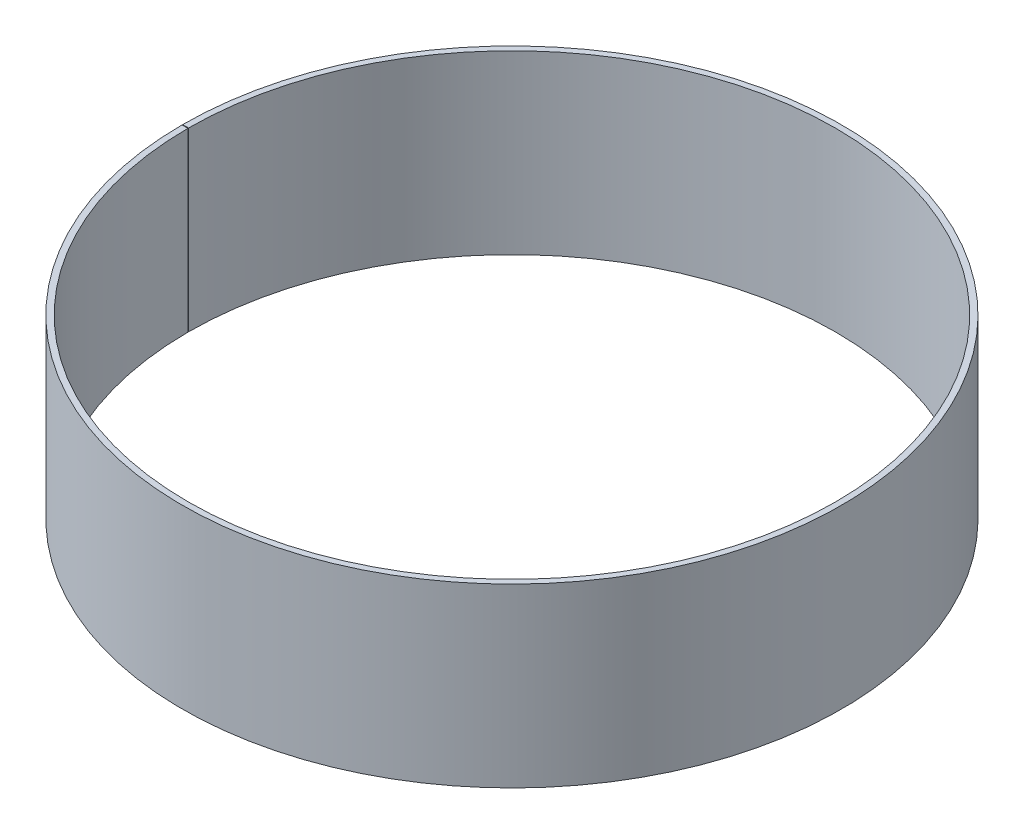
ISO-10303-21;
HEADER;
FILE_DESCRIPTION(('STEP AP214'),'2;1');
FILE_NAME('part.step','',(''),(''),'','','');
FILE_SCHEMA(('AUTOMOTIVE_DESIGN { 1 0 10303 214 1 1 1 1 }'));
ENDSEC;
DATA;
#1=APPLICATION_CONTEXT('core data for automotive mechanical design processes');
#2=APPLICATION_PROTOCOL_DEFINITION('international standard','automotive_design',2000,#1);
#3=PRODUCT_CONTEXT('',#1,'mechanical');
#4=PRODUCT('Part','Part','',(#3));
#5=PRODUCT_RELATED_PRODUCT_CATEGORY('part','',(#4));
#6=PRODUCT_DEFINITION_FORMATION('','',#4);
#7=PRODUCT_DEFINITION_CONTEXT('part definition',#1,'design');
#8=PRODUCT_DEFINITION('design','',#6,#7);
#9=PRODUCT_DEFINITION_SHAPE('','',#8);
#10=(LENGTH_UNIT() NAMED_UNIT(*) SI_UNIT(.MILLI.,.METRE.));
#11=(NAMED_UNIT(*) PLANE_ANGLE_UNIT() SI_UNIT($,.RADIAN.));
#12=(NAMED_UNIT(*) SI_UNIT($,.STERADIAN.) SOLID_ANGLE_UNIT());
#13=UNCERTAINTY_MEASURE_WITH_UNIT(LENGTH_MEASURE(1.E-05),#10,'distance_accuracy_value','');
#14=(GEOMETRIC_REPRESENTATION_CONTEXT(3) GLOBAL_UNCERTAINTY_ASSIGNED_CONTEXT((#13)) GLOBAL_UNIT_ASSIGNED_CONTEXT((#10,
#11,#12)) REPRESENTATION_CONTEXT('',''));
#15=CARTESIAN_POINT('',(0.,0.,0.));
#16=DIRECTION('',(0.,0.,1.));
#17=DIRECTION('',(1.,0.,0.));
#18=AXIS2_PLACEMENT_3D('',#15,#16,#17);
#19=CARTESIAN_POINT('',(0.,60.0000000000001,0.));
#20=DIRECTION('',(0.,-0.999999999999999,0.));
#21=DIRECTION('',(0.,0.,-0.999999999999999));
#22=AXIS2_PLACEMENT_3D('',#19,#20,#21);
#23=CYLINDRICAL_SURFACE('',#22,112.);
#24=CARTESIAN_POINT('',(0.,0.,0.));
#25=DIRECTION('',(0.,0.999999999999999,0.));
#26=DIRECTION('',(1.,0.,0.));
#27=AXIS2_PLACEMENT_3D('',#24,#25,#26);
#28=CIRCLE('',#27,112.);
#29=CARTESIAN_POINT('',(-111.999953718999,0.,0.101818181818092));
#30=VERTEX_POINT('',#29);
#31=CARTESIAN_POINT('',(-111.999953718999,0.,-0.101818181818314));
#32=VERTEX_POINT('',#31);
#33=EDGE_CURVE('E109',#30,#32,#28,.T.);
#34=ORIENTED_EDGE('',*,*,#33,.T.);
#35=DIRECTION('',(0.,-0.999999999999999,0.));
#36=VECTOR('',#35,1.);
#37=CARTESIAN_POINT('',(-111.999953718999,60.0000000000001,-0.101818181818314));
#38=LINE('',#37,#36);
#39=CARTESIAN_POINT('',(-111.999953718999,60.0000000000001,-0.101818181818314));
#40=VERTEX_POINT('',#39);
#41=EDGE_CURVE('E11',#40,#32,#38,.T.);
#42=ORIENTED_EDGE('',*,*,#41,.F.);
#43=CARTESIAN_POINT('',(0.,60.0000000000001,0.));
#44=DIRECTION('',(0.,0.999999999999999,0.));
#45=DIRECTION('',(1.,0.,0.));
#46=AXIS2_PLACEMENT_3D('',#43,#44,#45);
#47=CIRCLE('',#46,112.);
#48=CARTESIAN_POINT('',(-111.999953718999,60.0000000000001,0.101818181818092));
#49=VERTEX_POINT('',#48);
#50=EDGE_CURVE('E81',#49,#40,#47,.T.);
#51=ORIENTED_EDGE('',*,*,#50,.F.);
#52=DIRECTION('',(0.,-0.999999999999999,0.));
#53=VECTOR('',#52,1.);
#54=CARTESIAN_POINT('',(-111.999953718999,60.0000000000001,0.101818181818092));
#55=LINE('',#54,#53);
#56=EDGE_CURVE('E57',#49,#30,#55,.T.);
#57=ORIENTED_EDGE('',*,*,#56,.T.);
#58=EDGE_LOOP('',(#34,#42,#51,#57));
#59=FACE_BOUND('',#58,.T.);
#60=ADVANCED_FACE('F40',(#59),#23,.T.);
#61=CARTESIAN_POINT('',(-109.999954545445,60.0000000000001,-0.1000000000001));
#62=DIRECTION('',(-0.00090909090908875,0.,0.999999586776773));
#63=DIRECTION('',(0.999999586776774,0.,0.000909090909088583));
#64=AXIS2_PLACEMENT_3D('',#61,#62,#63);
#65=PLANE('',#64);
#66=DIRECTION('',(-0.999999586776774,0.,-0.000909090909088583));
#67=VECTOR('',#66,1.);
#68=CARTESIAN_POINT('',(-109.999954545445,0.,-0.1000000000001));
#69=LINE('',#68,#67);
#70=CARTESIAN_POINT('',(-109.999954545445,0.,-0.1000000000001));
#71=VERTEX_POINT('',#70);
#72=EDGE_CURVE('E90',#71,#32,#69,.T.);
#73=ORIENTED_EDGE('',*,*,#72,.F.);
#74=DIRECTION('',(0.,-0.999999999999999,0.));
#75=VECTOR('',#74,1.);
#76=CARTESIAN_POINT('',(-109.999954545445,60.0000000000001,-0.1000000000001));
#77=LINE('',#76,#75);
#78=CARTESIAN_POINT('',(-109.999954545445,60.0000000000001,-0.1000000000001));
#79=VERTEX_POINT('',#78);
#80=EDGE_CURVE('E49',#79,#71,#77,.T.);
#81=ORIENTED_EDGE('',*,*,#80,.F.);
#82=DIRECTION('',(-0.999999586776774,0.,-0.000909090909088583));
#83=VECTOR('',#82,1.);
#84=CARTESIAN_POINT('',(-109.999954545445,60.0000000000001,-0.1000000000001));
#85=LINE('',#84,#83);
#86=EDGE_CURVE('E88',#79,#40,#85,.T.);
#87=ORIENTED_EDGE('',*,*,#86,.T.);
#88=ORIENTED_EDGE('',*,*,#41,.T.);
#89=EDGE_LOOP('',(#73,#81,#87,#88));
#90=FACE_BOUND('',#89,.T.);
#91=ADVANCED_FACE('F87',(#90),#65,.T.);
#92=CARTESIAN_POINT('',(0.,60.0000000000001,0.));
#93=DIRECTION('',(0.,-0.999999999999999,0.));
#94=DIRECTION('',(0.,0.,-0.999999999999999));
#95=AXIS2_PLACEMENT_3D('',#92,#93,#94);
#96=CYLINDRICAL_SURFACE('',#95,110.);
#97=CARTESIAN_POINT('',(0.,0.,0.));
#98=DIRECTION('',(0.,0.999999999999999,0.));
#99=DIRECTION('',(0.,0.,0.999999999999999));
#100=AXIS2_PLACEMENT_3D('',#97,#98,#99);
#101=CIRCLE('',#100,110.);
#102=CARTESIAN_POINT('',(-109.999954545445,0.,0.099999999999989));
#103=VERTEX_POINT('',#102);
#104=EDGE_CURVE('E114',#103,#71,#101,.T.);
#105=ORIENTED_EDGE('',*,*,#104,.F.);
#106=DIRECTION('',(0.,-0.999999999999999,0.));
#107=VECTOR('',#106,1.);
#108=CARTESIAN_POINT('',(-109.999954545445,60.0000000000001,0.099999999999989));
#109=LINE('',#108,#107);
#110=CARTESIAN_POINT('',(-109.999954545445,60.0000000000001,0.099999999999989));
#111=VERTEX_POINT('',#110);
#112=EDGE_CURVE('E70',#111,#103,#109,.T.);
#113=ORIENTED_EDGE('',*,*,#112,.F.);
#114=CARTESIAN_POINT('',(0.,60.0000000000001,0.));
#115=DIRECTION('',(0.,0.999999999999999,0.));
#116=DIRECTION('',(0.,0.,0.999999999999999));
#117=AXIS2_PLACEMENT_3D('',#114,#115,#116);
#118=CIRCLE('',#117,110.);
#119=EDGE_CURVE('E97',#111,#79,#118,.T.);
#120=ORIENTED_EDGE('',*,*,#119,.T.);
#121=ORIENTED_EDGE('',*,*,#80,.T.);
#122=EDGE_LOOP('',(#105,#113,#120,#121));
#123=FACE_BOUND('',#122,.T.);
#124=ADVANCED_FACE('F100',(#123),#96,.F.);
#125=CARTESIAN_POINT('',(-111.999953718999,60.0000000000001,0.101818181818092));
#126=DIRECTION('',(-0.00090909090906871,0.,-0.999999586776773));
#127=DIRECTION('',(-0.999999586776774,0.,0.000909090909068933));
#128=AXIS2_PLACEMENT_3D('',#125,#126,#127);
#129=PLANE('',#128);
#130=DIRECTION('',(0.999999586776774,0.,-0.000909090909068933));
#131=VECTOR('',#130,1.);
#132=CARTESIAN_POINT('',(-111.999953718999,0.,0.101818181818092));
#133=LINE('',#132,#131);
#134=EDGE_CURVE('E117',#30,#103,#133,.T.);
#135=ORIENTED_EDGE('',*,*,#134,.F.);
#136=ORIENTED_EDGE('',*,*,#56,.F.);
#137=DIRECTION('',(0.999999586776774,0.,-0.000909090909068933));
#138=VECTOR('',#137,1.);
#139=CARTESIAN_POINT('',(-111.999953718999,60.0000000000001,0.101818181818092));
#140=LINE('',#139,#138);
#141=EDGE_CURVE('E102',#49,#111,#140,.T.);
#142=ORIENTED_EDGE('',*,*,#141,.T.);
#143=ORIENTED_EDGE('',*,*,#112,.T.);
#144=EDGE_LOOP('',(#135,#136,#142,#143));
#145=FACE_BOUND('',#144,.T.);
#146=ADVANCED_FACE('F135',(#145),#129,.T.);
#147=CARTESIAN_POINT('',(0.,60.0000000000001,0.));
#148=DIRECTION('',(0.,0.999999999999999,0.));
#149=DIRECTION('',(1.,0.,0.));
#150=AXIS2_PLACEMENT_3D('',#147,#148,#149);
#151=PLANE('',#150);
#152=ORIENTED_EDGE('',*,*,#50,.T.);
#153=ORIENTED_EDGE('',*,*,#86,.F.);
#154=ORIENTED_EDGE('',*,*,#119,.F.);
#155=ORIENTED_EDGE('',*,*,#141,.F.);
#156=EDGE_LOOP('',(#152,#153,#154,#155));
#157=FACE_BOUND('',#156,.T.);
#158=ADVANCED_FACE('F96',(#157),#151,.T.);
#159=CARTESIAN_POINT('',(0.,0.,0.));
#160=DIRECTION('',(0.,0.999999999999999,0.));
#161=DIRECTION('',(1.,0.,0.));
#162=AXIS2_PLACEMENT_3D('',#159,#160,#161);
#163=PLANE('',#162);
#164=ORIENTED_EDGE('',*,*,#33,.F.);
#165=ORIENTED_EDGE('',*,*,#134,.T.);
#166=ORIENTED_EDGE('',*,*,#104,.T.);
#167=ORIENTED_EDGE('',*,*,#72,.T.);
#168=EDGE_LOOP('',(#164,#165,#166,#167));
#169=FACE_BOUND('',#168,.T.);
#170=ADVANCED_FACE('F134',(#169),#163,.F.);
#171=CLOSED_SHELL('',(#60,#91,#124,#146,#158,#170));
#172=MANIFOLD_SOLID_BREP('B2',#171);
#173=ADVANCED_BREP_SHAPE_REPRESENTATION('',(#18,#172),#14);
#174=SHAPE_DEFINITION_REPRESENTATION(#9,#173);
ENDSEC;
END-ISO-10303-21;
